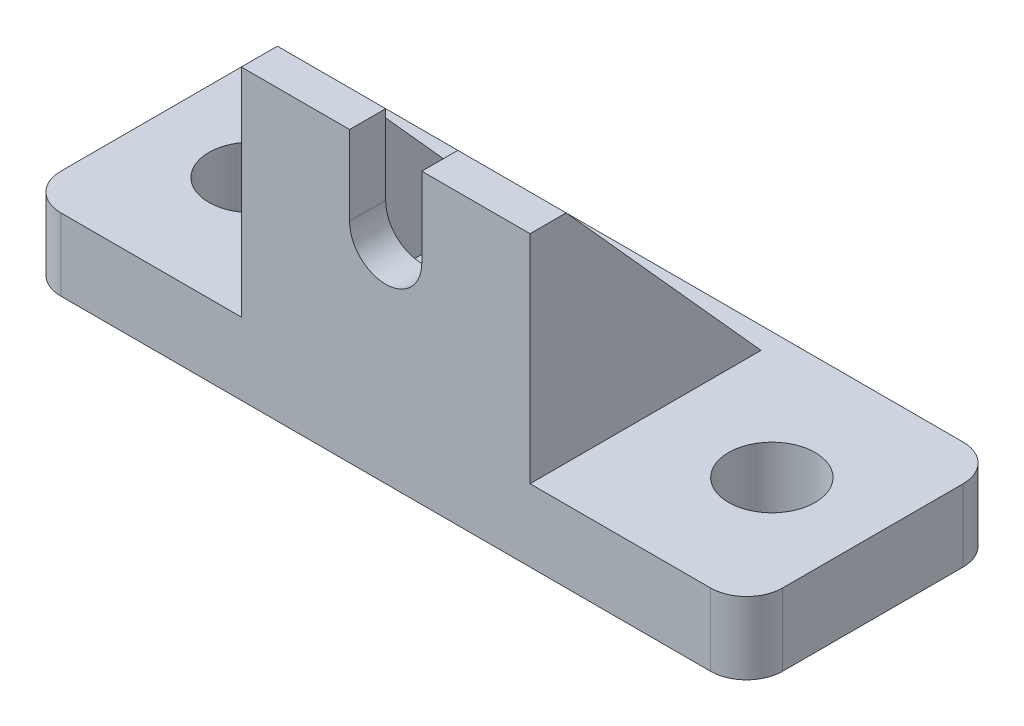
ISO-10303-21;
HEADER;
FILE_DESCRIPTION(('STEP AP214'),'2;1');
FILE_NAME('part.step','',(''),(''),'','','');
FILE_SCHEMA(('AUTOMOTIVE_DESIGN { 1 0 10303 214 1 1 1 1 }'));
ENDSEC;
DATA;
#1=APPLICATION_CONTEXT('core data for automotive mechanical design processes');
#2=APPLICATION_PROTOCOL_DEFINITION('international standard','automotive_design',2000,#1);
#3=PRODUCT_CONTEXT('',#1,'mechanical');
#4=PRODUCT('Part','Part','',(#3));
#5=PRODUCT_RELATED_PRODUCT_CATEGORY('part','',(#4));
#6=PRODUCT_DEFINITION_FORMATION('','',#4);
#7=PRODUCT_DEFINITION_CONTEXT('part definition',#1,'design');
#8=PRODUCT_DEFINITION('design','',#6,#7);
#9=PRODUCT_DEFINITION_SHAPE('','',#8);
#10=(LENGTH_UNIT() NAMED_UNIT(*) SI_UNIT(.MILLI.,.METRE.));
#11=(NAMED_UNIT(*) PLANE_ANGLE_UNIT() SI_UNIT($,.RADIAN.));
#12=(NAMED_UNIT(*) SI_UNIT($,.STERADIAN.) SOLID_ANGLE_UNIT());
#13=UNCERTAINTY_MEASURE_WITH_UNIT(LENGTH_MEASURE(1.E-05),#10,'distance_accuracy_value','');
#14=(GEOMETRIC_REPRESENTATION_CONTEXT(3) GLOBAL_UNCERTAINTY_ASSIGNED_CONTEXT((#13)) GLOBAL_UNIT_ASSIGNED_CONTEXT((#10,
#11,#12)) REPRESENTATION_CONTEXT('',''));
#15=CARTESIAN_POINT('',(0.,0.,0.));
#16=DIRECTION('',(0.,0.,1.));
#17=DIRECTION('',(1.,0.,0.));
#18=AXIS2_PLACEMENT_3D('',#15,#16,#17);
#19=CARTESIAN_POINT('',(0.,0.,57.0166014591585));
#20=DIRECTION('',(0.,0.,1.));
#21=DIRECTION('',(1.,0.,0.));
#22=AXIS2_PLACEMENT_3D('',#19,#20,#21);
#23=PLANE('',#22);
#24=DIRECTION('',(0.,-1.,0.));
#25=VECTOR('',#24,1.);
#26=CARTESIAN_POINT('',(-112.676154711175,0.,57.0166014591585));
#27=LINE('',#26,#25);
#28=CARTESIAN_POINT('',(-112.676154711175,40.,57.0166014591585));
#29=VERTEX_POINT('',#28);
#30=CARTESIAN_POINT('',(-112.676154711175,10.,57.0166014591585));
#31=VERTEX_POINT('',#30);
#32=EDGE_CURVE('E194',#29,#31,#27,.T.);
#33=ORIENTED_EDGE('',*,*,#32,.F.);
#34=DIRECTION('',(1.,0.,0.));
#35=VECTOR('',#34,1.);
#36=CARTESIAN_POINT('',(0.,40.,57.0166014591585));
#37=LINE('',#36,#35);
#38=CARTESIAN_POINT('',(-102.676154711175,40.,57.0166014591585));
#39=VERTEX_POINT('',#38);
#40=EDGE_CURVE('E177',#29,#39,#37,.T.);
#41=ORIENTED_EDGE('',*,*,#40,.T.);
#42=DIRECTION('',(0.,-1.,0.));
#43=VECTOR('',#42,1.);
#44=CARTESIAN_POINT('',(-102.676154711175,0.,57.0166014591585));
#45=LINE('',#44,#43);
#46=CARTESIAN_POINT('',(-102.676154711175,29.,57.0166014591585));
#47=VERTEX_POINT('',#46);
#48=EDGE_CURVE('E189',#39,#47,#45,.T.);
#49=ORIENTED_EDGE('',*,*,#48,.T.);
#50=CARTESIAN_POINT('',(-97.6761547111748,28.9367257155802,57.0166014591585));
#51=DIRECTION('',(0.,0.,1.));
#52=DIRECTION('',(1.,0.,0.));
#53=AXIS2_PLACEMENT_3D('',#50,#51,#52);
#54=CIRCLE('',#53,5.00040034747908);
#55=CARTESIAN_POINT('',(-92.6761547111748,29.,57.0166014591585));
#56=VERTEX_POINT('',#55);
#57=EDGE_CURVE('E236',#47,#56,#54,.T.);
#58=ORIENTED_EDGE('',*,*,#57,.T.);
#59=DIRECTION('',(0.,-1.,0.));
#60=VECTOR('',#59,1.);
#61=CARTESIAN_POINT('',(-92.6761547111748,0.,57.0166014591585));
#62=LINE('',#61,#60);
#63=CARTESIAN_POINT('',(-92.6761547111748,40.,57.0166014591585));
#64=VERTEX_POINT('',#63);
#65=EDGE_CURVE('E244',#64,#56,#62,.T.);
#66=ORIENTED_EDGE('',*,*,#65,.F.);
#67=CARTESIAN_POINT('',(-82.6761547111748,40.,57.0166014591585));
#68=VERTEX_POINT('',#67);
#69=EDGE_CURVE('E209',#64,#68,#37,.T.);
#70=ORIENTED_EDGE('',*,*,#69,.T.);
#71=DIRECTION('',(0.,1.,0.));
#72=VECTOR('',#71,1.);
#73=CARTESIAN_POINT('',(-82.6761547111748,0.,57.0166014591585));
#74=LINE('',#73,#72);
#75=CARTESIAN_POINT('',(-82.6761547111748,10.,57.0166014591585));
#76=VERTEX_POINT('',#75);
#77=EDGE_CURVE('E11',#76,#68,#74,.T.);
#78=ORIENTED_EDGE('',*,*,#77,.F.);
#79=DIRECTION('',(-1.,0.,0.));
#80=VECTOR('',#79,1.);
#81=CARTESIAN_POINT('',(0.,10.,57.0166014591585));
#82=LINE('',#81,#80);
#83=EDGE_CURVE('E196',#76,#31,#82,.T.);
#84=ORIENTED_EDGE('',*,*,#83,.T.);
#85=EDGE_LOOP('',(#33,#41,#49,#58,#66,#70,#78,#84));
#86=FACE_BOUND('',#85,.T.);
#87=ADVANCED_FACE('F47',(#86),#23,.F.);
#88=CARTESIAN_POINT('',(-142.676154711175,10.,57.0166014591585));
#89=DIRECTION('',(0.,1.,0.));
#90=DIRECTION('',(0.,0.,1.));
#91=AXIS2_PLACEMENT_3D('',#88,#89,#90);
#92=PLANE('',#91);
#93=DIRECTION('',(0.,0.,1.));
#94=VECTOR('',#93,1.);
#95=CARTESIAN_POINT('',(-117.676154711175,10.,57.0166014591585));
#96=LINE('',#95,#94);
#97=CARTESIAN_POINT('',(-117.676154711175,10.,30.0166014591585));
#98=VERTEX_POINT('',#97);
#99=CARTESIAN_POINT('',(-117.676154711175,10.,62.0166014591585));
#100=VERTEX_POINT('',#99);
#101=EDGE_CURVE('E63',#98,#100,#96,.T.);
#102=ORIENTED_EDGE('',*,*,#101,.F.);
#103=DIRECTION('',(-1.,0.,0.));
#104=VECTOR('',#103,1.);
#105=CARTESIAN_POINT('',(-142.676154711175,10.,30.0166014591585));
#106=LINE('',#105,#104);
#107=CARTESIAN_POINT('',(-112.676154711175,10.,30.0166014591585));
#108=VERTEX_POINT('',#107);
#109=EDGE_CURVE('E67',#108,#98,#106,.T.);
#110=ORIENTED_EDGE('',*,*,#109,.F.);
#111=DIRECTION('',(0.,0.,1.));
#112=VECTOR('',#111,1.);
#113=CARTESIAN_POINT('',(-112.676154711175,10.,57.0166014591585));
#114=LINE('',#113,#112);
#115=EDGE_CURVE('E200',#108,#31,#114,.T.);
#116=ORIENTED_EDGE('',*,*,#115,.T.);
#117=ORIENTED_EDGE('',*,*,#83,.F.);
#118=DIRECTION('',(0.,0.,-1.));
#119=VECTOR('',#118,1.);
#120=CARTESIAN_POINT('',(-82.6761547111748,10.,57.0166014591585));
#121=LINE('',#120,#119);
#122=CARTESIAN_POINT('',(-82.6761547111748,10.,30.0166014591585));
#123=VERTEX_POINT('',#122);
#124=EDGE_CURVE('E225',#76,#123,#121,.T.);
#125=ORIENTED_EDGE('',*,*,#124,.T.);
#126=DIRECTION('',(1.,0.,0.));
#127=VECTOR('',#126,1.);
#128=CARTESIAN_POINT('',(-142.676154711175,10.,30.0166014591584));
#129=LINE('',#128,#127);
#130=CARTESIAN_POINT('',(-77.6761547111748,10.,30.0166014591585));
#131=VERTEX_POINT('',#130);
#132=EDGE_CURVE('E231',#131,#123,#129,.F.);
#133=ORIENTED_EDGE('',*,*,#132,.F.);
#134=DIRECTION('',(0.,0.,1.));
#135=VECTOR('',#134,1.);
#136=CARTESIAN_POINT('',(-77.6761547111748,10.,57.0166014591585));
#137=LINE('',#136,#135);
#138=CARTESIAN_POINT('',(-77.6761547111748,10.,62.0166014591585));
#139=VERTEX_POINT('',#138);
#140=EDGE_CURVE('E280',#131,#139,#137,.T.);
#141=ORIENTED_EDGE('',*,*,#140,.T.);
#142=DIRECTION('',(1.,0.,0.));
#143=VECTOR('',#142,1.);
#144=CARTESIAN_POINT('',(-142.676154711175,10.,62.0166014591585));
#145=LINE('',#144,#143);
#146=CARTESIAN_POINT('',(-52.6761547111748,10.,62.0166014591585));
#147=VERTEX_POINT('',#146);
#148=EDGE_CURVE('E314',#139,#147,#145,.T.);
#149=ORIENTED_EDGE('',*,*,#148,.T.);
#150=CARTESIAN_POINT('',(-52.6761547111748,10.,57.0166014591585));
#151=DIRECTION('',(0.,1.,0.));
#152=DIRECTION('',(0.,0.,1.));
#153=AXIS2_PLACEMENT_3D('',#150,#151,#152);
#154=CIRCLE('',#153,5.);
#155=CARTESIAN_POINT('',(-47.6761547111748,10.,57.0166014591585));
#156=VERTEX_POINT('',#155);
#157=EDGE_CURVE('E319',#147,#156,#154,.T.);
#158=ORIENTED_EDGE('',*,*,#157,.T.);
#159=DIRECTION('',(0.,0.,-1.));
#160=VECTOR('',#159,1.);
#161=CARTESIAN_POINT('',(-47.6761547111748,10.,32.0166014591585));
#162=LINE('',#161,#160);
#163=CARTESIAN_POINT('',(-47.6761547111748,10.,32.0166014591585));
#164=VERTEX_POINT('',#163);
#165=EDGE_CURVE('E322',#156,#164,#162,.T.);
#166=ORIENTED_EDGE('',*,*,#165,.T.);
#167=CARTESIAN_POINT('',(-52.6761547111748,10.,32.0166014591585));
#168=DIRECTION('',(0.,1.,0.));
#169=DIRECTION('',(0.,0.,-1.));
#170=AXIS2_PLACEMENT_3D('',#167,#168,#169);
#171=CIRCLE('',#170,5.);
#172=CARTESIAN_POINT('',(-52.6761547111748,10.,27.0166014591585));
#173=VERTEX_POINT('',#172);
#174=EDGE_CURVE('E325',#164,#173,#171,.T.);
#175=ORIENTED_EDGE('',*,*,#174,.T.);
#176=DIRECTION('',(-1.,0.,0.));
#177=VECTOR('',#176,1.);
#178=CARTESIAN_POINT('',(-142.676154711175,10.,27.0166014591585));
#179=LINE('',#178,#177);
#180=CARTESIAN_POINT('',(-142.676154711175,10.,27.0166014591585));
#181=VERTEX_POINT('',#180);
#182=EDGE_CURVE('E328',#173,#181,#179,.T.);
#183=ORIENTED_EDGE('',*,*,#182,.T.);
#184=CARTESIAN_POINT('',(-142.676154711175,10.,32.0166014591585));
#185=DIRECTION('',(0.,1.,0.));
#186=DIRECTION('',(0.,0.,1.));
#187=AXIS2_PLACEMENT_3D('',#184,#185,#186);
#188=CIRCLE('',#187,5.);
#189=CARTESIAN_POINT('',(-147.676154711175,10.,32.0166014591585));
#190=VERTEX_POINT('',#189);
#191=EDGE_CURVE('E331',#181,#190,#188,.T.);
#192=ORIENTED_EDGE('',*,*,#191,.T.);
#193=DIRECTION('',(0.,0.,1.));
#194=VECTOR('',#193,1.);
#195=CARTESIAN_POINT('',(-147.676154711175,10.,32.0166014591585));
#196=LINE('',#195,#194);
#197=CARTESIAN_POINT('',(-147.676154711175,10.,57.0166014591585));
#198=VERTEX_POINT('',#197);
#199=EDGE_CURVE('E334',#190,#198,#196,.T.);
#200=ORIENTED_EDGE('',*,*,#199,.T.);
#201=CARTESIAN_POINT('',(-142.676154711175,10.,57.0166014591585));
#202=DIRECTION('',(0.,1.,0.));
#203=DIRECTION('',(0.,0.,1.));
#204=AXIS2_PLACEMENT_3D('',#201,#202,#203);
#205=CIRCLE('',#204,5.);
#206=CARTESIAN_POINT('',(-142.676154711175,10.,62.0166014591585));
#207=VERTEX_POINT('',#206);
#208=EDGE_CURVE('E310',#198,#207,#205,.T.);
#209=ORIENTED_EDGE('',*,*,#208,.T.);
#210=EDGE_CURVE('E316',#207,#100,#145,.T.);
#211=ORIENTED_EDGE('',*,*,#210,.T.);
#212=EDGE_LOOP('',(#102,#110,#116,#117,#125,#133,#141,#149,#158,#166,#175,#183,#192,#200,#209,#211));
#213=FACE_BOUND('',#212,.T.);
#214=CARTESIAN_POINT('',(-133.676154711175,10.,44.5166014591585));
#215=DIRECTION('',(0.,1.,0.));
#216=DIRECTION('',(0.,0.,1.));
#217=AXIS2_PLACEMENT_3D('',#214,#215,#216);
#218=CIRCLE('',#217,6.00000000000002);
#219=CARTESIAN_POINT('',(-133.676154711175,10.,50.5166014591585));
#220=VERTEX_POINT('',#219);
#221=EDGE_CURVE('E302',#220,#220,#218,.T.);
#222=ORIENTED_EDGE('',*,*,#221,.F.);
#223=EDGE_LOOP('',(#222));
#224=FACE_BOUND('',#223,.T.);
#225=CARTESIAN_POINT('',(-61.6761547111748,10.,44.5166014591585));
#226=DIRECTION('',(0.,1.,0.));
#227=DIRECTION('',(0.,0.,1.));
#228=AXIS2_PLACEMENT_3D('',#225,#226,#227);
#229=CIRCLE('',#228,6.);
#230=CARTESIAN_POINT('',(-61.6761547111748,10.,50.5166014591585));
#231=VERTEX_POINT('',#230);
#232=EDGE_CURVE('E294',#231,#231,#229,.T.);
#233=ORIENTED_EDGE('',*,*,#232,.F.);
#234=EDGE_LOOP('',(#233));
#235=FACE_BOUND('',#234,.T.);
#236=ADVANCED_FACE('F415',(#213,#224,#235),#92,.T.);
#237=CARTESIAN_POINT('',(-142.676154711175,0.,57.0166014591585));
#238=DIRECTION('',(0.,1.,0.));
#239=DIRECTION('',(0.,0.,1.));
#240=AXIS2_PLACEMENT_3D('',#237,#238,#239);
#241=PLANE('',#240);
#242=CARTESIAN_POINT('',(-142.676154711175,0.,32.0166014591585));
#243=DIRECTION('',(0.,1.,0.));
#244=DIRECTION('',(0.,0.,1.));
#245=AXIS2_PLACEMENT_3D('',#242,#243,#244);
#246=CIRCLE('',#245,5.);
#247=CARTESIAN_POINT('',(-142.676154711175,0.,27.0166014591585));
#248=VERTEX_POINT('',#247);
#249=CARTESIAN_POINT('',(-147.676154711175,0.,32.0166014591585));
#250=VERTEX_POINT('',#249);
#251=EDGE_CURVE('E356',#248,#250,#246,.T.);
#252=ORIENTED_EDGE('',*,*,#251,.F.);
#253=DIRECTION('',(-1.,0.,0.));
#254=VECTOR('',#253,1.);
#255=CARTESIAN_POINT('',(-142.676154711175,0.,27.0166014591585));
#256=LINE('',#255,#254);
#257=CARTESIAN_POINT('',(-52.6761547111748,0.,27.0166014591585));
#258=VERTEX_POINT('',#257);
#259=EDGE_CURVE('E353',#258,#248,#256,.T.);
#260=ORIENTED_EDGE('',*,*,#259,.F.);
#261=CARTESIAN_POINT('',(-52.6761547111748,0.,32.0166014591585));
#262=DIRECTION('',(0.,1.,0.));
#263=DIRECTION('',(0.,0.,-1.));
#264=AXIS2_PLACEMENT_3D('',#261,#262,#263);
#265=CIRCLE('',#264,5.);
#266=CARTESIAN_POINT('',(-47.6761547111748,0.,32.0166014591585));
#267=VERTEX_POINT('',#266);
#268=EDGE_CURVE('E350',#267,#258,#265,.T.);
#269=ORIENTED_EDGE('',*,*,#268,.F.);
#270=DIRECTION('',(0.,0.,-1.));
#271=VECTOR('',#270,1.);
#272=CARTESIAN_POINT('',(-47.6761547111748,0.,32.0166014591585));
#273=LINE('',#272,#271);
#274=CARTESIAN_POINT('',(-47.6761547111748,0.,57.0166014591585));
#275=VERTEX_POINT('',#274);
#276=EDGE_CURVE('E347',#275,#267,#273,.T.);
#277=ORIENTED_EDGE('',*,*,#276,.F.);
#278=CARTESIAN_POINT('',(-52.6761547111748,0.,57.0166014591585));
#279=DIRECTION('',(0.,1.,0.));
#280=DIRECTION('',(0.,0.,1.));
#281=AXIS2_PLACEMENT_3D('',#278,#279,#280);
#282=CIRCLE('',#281,5.);
#283=CARTESIAN_POINT('',(-52.6761547111748,0.,62.0166014591585));
#284=VERTEX_POINT('',#283);
#285=EDGE_CURVE('E344',#284,#275,#282,.T.);
#286=ORIENTED_EDGE('',*,*,#285,.F.);
#287=DIRECTION('',(1.,0.,0.));
#288=VECTOR('',#287,1.);
#289=CARTESIAN_POINT('',(-142.676154711175,0.,62.0166014591585));
#290=LINE('',#289,#288);
#291=CARTESIAN_POINT('',(-142.676154711175,0.,62.0166014591585));
#292=VERTEX_POINT('',#291);
#293=EDGE_CURVE('E341',#292,#284,#290,.T.);
#294=ORIENTED_EDGE('',*,*,#293,.F.);
#295=CARTESIAN_POINT('',(-142.676154711175,0.,57.0166014591585));
#296=DIRECTION('',(0.,1.,0.));
#297=DIRECTION('',(0.,0.,1.));
#298=AXIS2_PLACEMENT_3D('',#295,#296,#297);
#299=CIRCLE('',#298,5.);
#300=CARTESIAN_POINT('',(-147.676154711175,0.,57.0166014591585));
#301=VERTEX_POINT('',#300);
#302=EDGE_CURVE('E306',#301,#292,#299,.T.);
#303=ORIENTED_EDGE('',*,*,#302,.F.);
#304=DIRECTION('',(0.,0.,1.));
#305=VECTOR('',#304,1.);
#306=CARTESIAN_POINT('',(-147.676154711175,0.,32.0166014591585));
#307=LINE('',#306,#305);
#308=EDGE_CURVE('E315',#250,#301,#307,.T.);
#309=ORIENTED_EDGE('',*,*,#308,.F.);
#310=EDGE_LOOP('',(#252,#260,#269,#277,#286,#294,#303,#309));
#311=FACE_BOUND('',#310,.T.);
#312=CARTESIAN_POINT('',(-133.676154711175,0.,44.5166014591585));
#313=DIRECTION('',(0.,1.,0.));
#314=DIRECTION('',(0.,0.,1.));
#315=AXIS2_PLACEMENT_3D('',#312,#313,#314);
#316=CIRCLE('',#315,6.00000000000002);
#317=CARTESIAN_POINT('',(-133.676154711175,0.,50.5166014591585));
#318=VERTEX_POINT('',#317);
#319=EDGE_CURVE('E298',#318,#318,#316,.T.);
#320=ORIENTED_EDGE('',*,*,#319,.T.);
#321=EDGE_LOOP('',(#320));
#322=FACE_BOUND('',#321,.T.);
#323=CARTESIAN_POINT('',(-61.6761547111748,0.,44.5166014591585));
#324=DIRECTION('',(0.,1.,0.));
#325=DIRECTION('',(0.,0.,1.));
#326=AXIS2_PLACEMENT_3D('',#323,#324,#325);
#327=CIRCLE('',#326,6.);
#328=CARTESIAN_POINT('',(-61.6761547111748,0.,50.5166014591585));
#329=VERTEX_POINT('',#328);
#330=EDGE_CURVE('E272',#329,#329,#327,.T.);
#331=ORIENTED_EDGE('',*,*,#330,.T.);
#332=EDGE_LOOP('',(#331));
#333=FACE_BOUND('',#332,.T.);
#334=ADVANCED_FACE('F401',(#311,#322,#333),#241,.F.);
#335=CARTESIAN_POINT('',(-142.676154711175,10.,57.0166014591585));
#336=DIRECTION('',(0.,-1.,0.));
#337=DIRECTION('',(0.,0.,-1.));
#338=AXIS2_PLACEMENT_3D('',#335,#336,#337);
#339=CYLINDRICAL_SURFACE('',#338,5.);
#340=ORIENTED_EDGE('',*,*,#302,.T.);
#341=DIRECTION('',(0.,-1.,0.));
#342=VECTOR('',#341,1.);
#343=CARTESIAN_POINT('',(-142.676154711175,10.,62.0166014591585));
#344=LINE('',#343,#342);
#345=EDGE_CURVE('E56',#207,#292,#344,.T.);
#346=ORIENTED_EDGE('',*,*,#345,.F.);
#347=ORIENTED_EDGE('',*,*,#208,.F.);
#348=DIRECTION('',(0.,-1.,0.));
#349=VECTOR('',#348,1.);
#350=CARTESIAN_POINT('',(-147.676154711175,10.,57.0166014591585));
#351=LINE('',#350,#349);
#352=EDGE_CURVE('E337',#198,#301,#351,.T.);
#353=ORIENTED_EDGE('',*,*,#352,.T.);
#354=EDGE_LOOP('',(#340,#346,#347,#353));
#355=FACE_BOUND('',#354,.T.);
#356=ADVANCED_FACE('F49',(#355),#339,.T.);
#357=CARTESIAN_POINT('',(-142.676154711175,10.,62.0166014591585));
#358=DIRECTION('',(0.,0.,-1.));
#359=DIRECTION('',(-1.,0.,0.));
#360=AXIS2_PLACEMENT_3D('',#357,#358,#359);
#361=PLANE('',#360);
#362=ORIENTED_EDGE('',*,*,#293,.T.);
#363=DIRECTION('',(0.,-1.,0.));
#364=VECTOR('',#363,1.);
#365=CARTESIAN_POINT('',(-52.6761547111748,10.,62.0166014591585));
#366=LINE('',#365,#364);
#367=EDGE_CURVE('E384',#147,#284,#366,.T.);
#368=ORIENTED_EDGE('',*,*,#367,.F.);
#369=ORIENTED_EDGE('',*,*,#148,.F.);
#370=DIRECTION('',(0.,1.,0.));
#371=VECTOR('',#370,1.);
#372=CARTESIAN_POINT('',(-77.6761547111748,0.,62.0166014591585));
#373=LINE('',#372,#371);
#374=CARTESIAN_POINT('',(-77.6761547111748,40.,62.0166014591585));
#375=VERTEX_POINT('',#374);
#376=EDGE_CURVE('E262',#139,#375,#373,.T.);
#377=ORIENTED_EDGE('',*,*,#376,.T.);
#378=DIRECTION('',(1.,0.,0.));
#379=VECTOR('',#378,1.);
#380=CARTESIAN_POINT('',(0.,40.,62.0166014591585));
#381=LINE('',#380,#379);
#382=CARTESIAN_POINT('',(-92.6761547111748,40.,62.0166014591585));
#383=VERTEX_POINT('',#382);
#384=EDGE_CURVE('E259',#383,#375,#381,.T.);
#385=ORIENTED_EDGE('',*,*,#384,.F.);
#386=DIRECTION('',(0.,-1.,0.));
#387=VECTOR('',#386,1.);
#388=CARTESIAN_POINT('',(-92.6761547111748,0.,62.0166014591585));
#389=LINE('',#388,#387);
#390=CARTESIAN_POINT('',(-92.6761547111748,29.,62.0166014591585));
#391=VERTEX_POINT('',#390);
#392=EDGE_CURVE('E239',#383,#391,#389,.T.);
#393=ORIENTED_EDGE('',*,*,#392,.T.);
#394=CARTESIAN_POINT('',(-97.6761547111748,28.9367257155802,62.0166014591585));
#395=DIRECTION('',(0.,0.,1.));
#396=DIRECTION('',(1.,0.,0.));
#397=AXIS2_PLACEMENT_3D('',#394,#395,#396);
#398=CIRCLE('',#397,5.00040034747908);
#399=CARTESIAN_POINT('',(-102.676154711175,29.,62.0166014591585));
#400=VERTEX_POINT('',#399);
#401=EDGE_CURVE('E235',#400,#391,#398,.T.);
#402=ORIENTED_EDGE('',*,*,#401,.F.);
#403=DIRECTION('',(0.,-1.,0.));
#404=VECTOR('',#403,1.);
#405=CARTESIAN_POINT('',(-102.676154711175,0.,62.0166014591585));
#406=LINE('',#405,#404);
#407=CARTESIAN_POINT('',(-102.676154711175,40.,62.0166014591585));
#408=VERTEX_POINT('',#407);
#409=EDGE_CURVE('E252',#408,#400,#406,.T.);
#410=ORIENTED_EDGE('',*,*,#409,.F.);
#411=CARTESIAN_POINT('',(-117.676154711175,40.,62.0166014591585));
#412=VERTEX_POINT('',#411);
#413=EDGE_CURVE('E255',#412,#408,#381,.T.);
#414=ORIENTED_EDGE('',*,*,#413,.F.);
#415=DIRECTION('',(0.,1.,0.));
#416=VECTOR('',#415,1.);
#417=CARTESIAN_POINT('',(-117.676154711175,0.,62.0166014591585));
#418=LINE('',#417,#416);
#419=EDGE_CURVE('E258',#100,#412,#418,.T.);
#420=ORIENTED_EDGE('',*,*,#419,.F.);
#421=ORIENTED_EDGE('',*,*,#210,.F.);
#422=ORIENTED_EDGE('',*,*,#345,.T.);
#423=EDGE_LOOP('',(#362,#368,#369,#377,#385,#393,#402,#410,#414,#420,#421,#422));
#424=FACE_BOUND('',#423,.T.);
#425=ADVANCED_FACE('F391',(#424),#361,.F.);
#426=CARTESIAN_POINT('',(-52.6761547111748,10.,57.0166014591585));
#427=DIRECTION('',(0.,-1.,0.));
#428=DIRECTION('',(0.,0.,-1.));
#429=AXIS2_PLACEMENT_3D('',#426,#427,#428);
#430=CYLINDRICAL_SURFACE('',#429,5.);
#431=ORIENTED_EDGE('',*,*,#285,.T.);
#432=DIRECTION('',(0.,-1.,0.));
#433=VECTOR('',#432,1.);
#434=CARTESIAN_POINT('',(-47.6761547111748,10.,57.0166014591585));
#435=LINE('',#434,#433);
#436=EDGE_CURVE('E380',#156,#275,#435,.T.);
#437=ORIENTED_EDGE('',*,*,#436,.F.);
#438=ORIENTED_EDGE('',*,*,#157,.F.);
#439=ORIENTED_EDGE('',*,*,#367,.T.);
#440=EDGE_LOOP('',(#431,#437,#438,#439));
#441=FACE_BOUND('',#440,.T.);
#442=ADVANCED_FACE('F408',(#441),#430,.T.);
#443=CARTESIAN_POINT('',(-47.6761547111748,10.,32.0166014591585));
#444=DIRECTION('',(-1.,0.,0.));
#445=DIRECTION('',(0.,0.,1.));
#446=AXIS2_PLACEMENT_3D('',#443,#444,#445);
#447=PLANE('',#446);
#448=ORIENTED_EDGE('',*,*,#276,.T.);
#449=DIRECTION('',(0.,-1.,0.));
#450=VECTOR('',#449,1.);
#451=CARTESIAN_POINT('',(-47.6761547111748,10.,32.0166014591585));
#452=LINE('',#451,#450);
#453=EDGE_CURVE('E376',#164,#267,#452,.T.);
#454=ORIENTED_EDGE('',*,*,#453,.F.);
#455=ORIENTED_EDGE('',*,*,#165,.F.);
#456=ORIENTED_EDGE('',*,*,#436,.T.);
#457=EDGE_LOOP('',(#448,#454,#455,#456));
#458=FACE_BOUND('',#457,.T.);
#459=ADVANCED_FACE('F412',(#458),#447,.F.);
#460=CARTESIAN_POINT('',(-52.6761547111748,10.,32.0166014591585));
#461=DIRECTION('',(0.,-1.,0.));
#462=DIRECTION('',(0.,0.,-1.));
#463=AXIS2_PLACEMENT_3D('',#460,#461,#462);
#464=CYLINDRICAL_SURFACE('',#463,5.);
#465=ORIENTED_EDGE('',*,*,#268,.T.);
#466=DIRECTION('',(0.,-1.,0.));
#467=VECTOR('',#466,1.);
#468=CARTESIAN_POINT('',(-52.6761547111748,10.,27.0166014591585));
#469=LINE('',#468,#467);
#470=EDGE_CURVE('E372',#173,#258,#469,.T.);
#471=ORIENTED_EDGE('',*,*,#470,.F.);
#472=ORIENTED_EDGE('',*,*,#174,.F.);
#473=ORIENTED_EDGE('',*,*,#453,.T.);
#474=EDGE_LOOP('',(#465,#471,#472,#473));
#475=FACE_BOUND('',#474,.T.);
#476=ADVANCED_FACE('F495',(#475),#464,.T.);
#477=CARTESIAN_POINT('',(-142.676154711175,10.,27.0166014591585));
#478=DIRECTION('',(0.,0.,1.));
#479=DIRECTION('',(1.,0.,0.));
#480=AXIS2_PLACEMENT_3D('',#477,#478,#479);
#481=PLANE('',#480);
#482=ORIENTED_EDGE('',*,*,#259,.T.);
#483=DIRECTION('',(0.,-1.,0.));
#484=VECTOR('',#483,1.);
#485=CARTESIAN_POINT('',(-142.676154711175,10.,27.0166014591585));
#486=LINE('',#485,#484);
#487=EDGE_CURVE('E368',#181,#248,#486,.T.);
#488=ORIENTED_EDGE('',*,*,#487,.F.);
#489=ORIENTED_EDGE('',*,*,#182,.F.);
#490=ORIENTED_EDGE('',*,*,#470,.T.);
#491=EDGE_LOOP('',(#482,#488,#489,#490));
#492=FACE_BOUND('',#491,.T.);
#493=ADVANCED_FACE('F492',(#492),#481,.F.);
#494=CARTESIAN_POINT('',(-142.676154711175,10.,32.0166014591585));
#495=DIRECTION('',(0.,-1.,0.));
#496=DIRECTION('',(0.,0.,-1.));
#497=AXIS2_PLACEMENT_3D('',#494,#495,#496);
#498=CYLINDRICAL_SURFACE('',#497,5.);
#499=ORIENTED_EDGE('',*,*,#251,.T.);
#500=DIRECTION('',(0.,-1.,0.));
#501=VECTOR('',#500,1.);
#502=CARTESIAN_POINT('',(-147.676154711175,10.,32.0166014591585));
#503=LINE('',#502,#501);
#504=EDGE_CURVE('E364',#190,#250,#503,.T.);
#505=ORIENTED_EDGE('',*,*,#504,.F.);
#506=ORIENTED_EDGE('',*,*,#191,.F.);
#507=ORIENTED_EDGE('',*,*,#487,.T.);
#508=EDGE_LOOP('',(#499,#505,#506,#507));
#509=FACE_BOUND('',#508,.T.);
#510=ADVANCED_FACE('F488',(#509),#498,.T.);
#511=CARTESIAN_POINT('',(-147.676154711175,10.,32.0166014591585));
#512=DIRECTION('',(1.,0.,0.));
#513=DIRECTION('',(0.,0.,-1.));
#514=AXIS2_PLACEMENT_3D('',#511,#512,#513);
#515=PLANE('',#514);
#516=ORIENTED_EDGE('',*,*,#308,.T.);
#517=ORIENTED_EDGE('',*,*,#352,.F.);
#518=ORIENTED_EDGE('',*,*,#199,.F.);
#519=ORIENTED_EDGE('',*,*,#504,.T.);
#520=EDGE_LOOP('',(#516,#517,#518,#519));
#521=FACE_BOUND('',#520,.T.);
#522=ADVANCED_FACE('F486',(#521),#515,.F.);
#523=CARTESIAN_POINT('',(-133.676154711175,10.,44.5166014591585));
#524=DIRECTION('',(0.,-1.,0.));
#525=DIRECTION('',(0.,0.,-1.));
#526=AXIS2_PLACEMENT_3D('',#523,#524,#525);
#527=CYLINDRICAL_SURFACE('',#526,6.00000000000002);
#528=ORIENTED_EDGE('',*,*,#221,.T.);
#529=EDGE_LOOP('',(#528));
#530=FACE_BOUND('',#529,.T.);
#531=ORIENTED_EDGE('',*,*,#319,.F.);
#532=EDGE_LOOP('',(#531));
#533=FACE_BOUND('',#532,.T.);
#534=ADVANCED_FACE('F520',(#530,#533),#527,.F.);
#535=CARTESIAN_POINT('',(-61.6761547111748,10.,44.5166014591585));
#536=DIRECTION('',(0.,-1.,0.));
#537=DIRECTION('',(0.,0.,-1.));
#538=AXIS2_PLACEMENT_3D('',#535,#536,#537);
#539=CYLINDRICAL_SURFACE('',#538,6.);
#540=ORIENTED_EDGE('',*,*,#232,.T.);
#541=EDGE_LOOP('',(#540));
#542=FACE_BOUND('',#541,.T.);
#543=ORIENTED_EDGE('',*,*,#330,.F.);
#544=EDGE_LOOP('',(#543));
#545=FACE_BOUND('',#544,.T.);
#546=ADVANCED_FACE('F536',(#542,#545),#539,.F.);
#547=CARTESIAN_POINT('',(-97.6761547111748,28.9367257155802,57.0166014591585));
#548=DIRECTION('',(0.,0.,1.));
#549=DIRECTION('',(1.,0.,0.));
#550=AXIS2_PLACEMENT_3D('',#547,#548,#549);
#551=CYLINDRICAL_SURFACE('',#550,5.00040034747908);
#552=ORIENTED_EDGE('',*,*,#401,.T.);
#553=DIRECTION('',(0.,0.,1.));
#554=VECTOR('',#553,1.);
#555=CARTESIAN_POINT('',(-92.6761547111748,29.,57.0166014591585));
#556=LINE('',#555,#554);
#557=EDGE_CURVE('E269',#56,#391,#556,.T.);
#558=ORIENTED_EDGE('',*,*,#557,.F.);
#559=ORIENTED_EDGE('',*,*,#57,.F.);
#560=DIRECTION('',(0.,0.,1.));
#561=VECTOR('',#560,1.);
#562=CARTESIAN_POINT('',(-102.676154711175,29.,57.0166014591585));
#563=LINE('',#562,#561);
#564=EDGE_CURVE('E248',#47,#400,#563,.T.);
#565=ORIENTED_EDGE('',*,*,#564,.T.);
#566=EDGE_LOOP('',(#552,#558,#559,#565));
#567=FACE_BOUND('',#566,.T.);
#568=ADVANCED_FACE('F449',(#567),#551,.F.);
#569=CARTESIAN_POINT('',(-92.6761547111748,0.,57.0166014591585));
#570=DIRECTION('',(-1.,0.,0.));
#571=DIRECTION('',(0.,0.,1.));
#572=AXIS2_PLACEMENT_3D('',#569,#570,#571);
#573=PLANE('',#572);
#574=ORIENTED_EDGE('',*,*,#392,.F.);
#575=DIRECTION('',(0.,0.,1.));
#576=VECTOR('',#575,1.);
#577=CARTESIAN_POINT('',(-92.6761547111748,40.,57.0166014591585));
#578=LINE('',#577,#576);
#579=EDGE_CURVE('E273',#64,#383,#578,.T.);
#580=ORIENTED_EDGE('',*,*,#579,.F.);
#581=ORIENTED_EDGE('',*,*,#65,.T.);
#582=ORIENTED_EDGE('',*,*,#557,.T.);
#583=EDGE_LOOP('',(#574,#580,#581,#582));
#584=FACE_BOUND('',#583,.T.);
#585=ADVANCED_FACE('F444',(#584),#573,.T.);
#586=CARTESIAN_POINT('',(0.,40.,57.0166014591585));
#587=DIRECTION('',(0.,-1.,0.));
#588=DIRECTION('',(0.,0.,-1.));
#589=AXIS2_PLACEMENT_3D('',#586,#587,#588);
#590=PLANE('',#589);
#591=CARTESIAN_POINT('',(-77.6761547111748,40.,57.0166014591585));
#592=VERTEX_POINT('',#591);
#593=EDGE_CURVE('E191',#68,#592,#37,.T.);
#594=ORIENTED_EDGE('',*,*,#593,.F.);
#595=ORIENTED_EDGE('',*,*,#69,.F.);
#596=ORIENTED_EDGE('',*,*,#579,.T.);
#597=ORIENTED_EDGE('',*,*,#384,.T.);
#598=DIRECTION('',(0.,0.,1.));
#599=VECTOR('',#598,1.);
#600=CARTESIAN_POINT('',(-77.6761547111748,40.,57.0166014591585));
#601=LINE('',#600,#599);
#602=EDGE_CURVE('E276',#592,#375,#601,.T.);
#603=ORIENTED_EDGE('',*,*,#602,.F.);
#604=EDGE_LOOP('',(#594,#595,#596,#597,#603));
#605=FACE_BOUND('',#604,.T.);
#606=ADVANCED_FACE('F428',(#605),#590,.F.);
#607=CARTESIAN_POINT('',(-77.6761547111748,0.,57.0166014591585));
#608=DIRECTION('',(1.,0.,0.));
#609=DIRECTION('',(0.,0.,-1.));
#610=AXIS2_PLACEMENT_3D('',#607,#608,#609);
#611=PLANE('',#610);
#612=ORIENTED_EDGE('',*,*,#376,.F.);
#613=ORIENTED_EDGE('',*,*,#140,.F.);
#614=DIRECTION('',(0.,-0.743294146247166,-0.66896473162245));
#615=VECTOR('',#614,1.);
#616=CARTESIAN_POINT('',(-77.6761547111748,40.,57.0166014591585));
#617=LINE('',#616,#615);
#618=EDGE_CURVE('E221',#592,#131,#617,.T.);
#619=ORIENTED_EDGE('',*,*,#618,.F.);
#620=ORIENTED_EDGE('',*,*,#602,.T.);
#621=EDGE_LOOP('',(#612,#613,#619,#620));
#622=FACE_BOUND('',#621,.T.);
#623=ADVANCED_FACE('F433',(#622),#611,.T.);
#624=CARTESIAN_POINT('',(-117.676154711175,0.,57.0166014591585));
#625=DIRECTION('',(1.,0.,0.));
#626=DIRECTION('',(0.,0.,-1.));
#627=AXIS2_PLACEMENT_3D('',#624,#625,#626);
#628=PLANE('',#627);
#629=ORIENTED_EDGE('',*,*,#419,.T.);
#630=DIRECTION('',(0.,0.,1.));
#631=VECTOR('',#630,1.);
#632=CARTESIAN_POINT('',(-117.676154711175,40.,57.0166014591585));
#633=LINE('',#632,#631);
#634=CARTESIAN_POINT('',(-117.676154711175,40.,57.0166014591585));
#635=VERTEX_POINT('',#634);
#636=EDGE_CURVE('E286',#635,#412,#633,.T.);
#637=ORIENTED_EDGE('',*,*,#636,.F.);
#638=DIRECTION('',(0.,-0.743294146247166,-0.66896473162245));
#639=VECTOR('',#638,1.);
#640=CARTESIAN_POINT('',(-117.676154711175,40.,57.0166014591585));
#641=LINE('',#640,#639);
#642=EDGE_CURVE('E201',#635,#98,#641,.T.);
#643=ORIENTED_EDGE('',*,*,#642,.T.);
#644=ORIENTED_EDGE('',*,*,#101,.T.);
#645=EDGE_LOOP('',(#629,#637,#643,#644));
#646=FACE_BOUND('',#645,.T.);
#647=ADVANCED_FACE('F462',(#646),#628,.F.);
#648=ORIENTED_EDGE('',*,*,#413,.T.);
#649=DIRECTION('',(0.,0.,1.));
#650=VECTOR('',#649,1.);
#651=CARTESIAN_POINT('',(-102.676154711175,40.,57.0166014591585));
#652=LINE('',#651,#650);
#653=EDGE_CURVE('E185',#39,#408,#652,.T.);
#654=ORIENTED_EDGE('',*,*,#653,.F.);
#655=ORIENTED_EDGE('',*,*,#40,.F.);
#656=EDGE_CURVE('E182',#635,#29,#37,.T.);
#657=ORIENTED_EDGE('',*,*,#656,.F.);
#658=ORIENTED_EDGE('',*,*,#636,.T.);
#659=EDGE_LOOP('',(#648,#654,#655,#657,#658));
#660=FACE_BOUND('',#659,.T.);
#661=ADVANCED_FACE('F179',(#660),#590,.F.);
#662=CARTESIAN_POINT('',(-102.676154711175,0.,57.0166014591585));
#663=DIRECTION('',(-1.,0.,0.));
#664=DIRECTION('',(0.,0.,1.));
#665=AXIS2_PLACEMENT_3D('',#662,#663,#664);
#666=PLANE('',#665);
#667=ORIENTED_EDGE('',*,*,#409,.T.);
#668=ORIENTED_EDGE('',*,*,#564,.F.);
#669=ORIENTED_EDGE('',*,*,#48,.F.);
#670=ORIENTED_EDGE('',*,*,#653,.T.);
#671=EDGE_LOOP('',(#667,#668,#669,#670));
#672=FACE_BOUND('',#671,.T.);
#673=ADVANCED_FACE('F452',(#672),#666,.F.);
#674=CARTESIAN_POINT('',(-77.6761547111748,40.,57.0166014591585));
#675=DIRECTION('',(0.,-0.66896473162245,0.743294146247166));
#676=DIRECTION('',(0.,-0.743294146247166,-0.66896473162245));
#677=AXIS2_PLACEMENT_3D('',#674,#675,#676);
#678=PLANE('',#677);
#679=ORIENTED_EDGE('',*,*,#618,.T.);
#680=ORIENTED_EDGE('',*,*,#132,.T.);
#681=DIRECTION('',(0.,-0.743294146247166,-0.66896473162245));
#682=VECTOR('',#681,1.);
#683=CARTESIAN_POINT('',(-82.6761547111748,40.,57.0166014591585));
#684=LINE('',#683,#682);
#685=EDGE_CURVE('E220',#68,#123,#684,.T.);
#686=ORIENTED_EDGE('',*,*,#685,.F.);
#687=ORIENTED_EDGE('',*,*,#593,.T.);
#688=EDGE_LOOP('',(#679,#680,#686,#687));
#689=FACE_BOUND('',#688,.T.);
#690=ADVANCED_FACE('F435',(#689),#678,.F.);
#691=CARTESIAN_POINT('',(-82.6761547111748,20.,44.5166014591585));
#692=DIRECTION('',(1.,0.,0.));
#693=DIRECTION('',(0.,0.,-1.));
#694=AXIS2_PLACEMENT_3D('',#691,#692,#693);
#695=PLANE('',#694);
#696=ORIENTED_EDGE('',*,*,#124,.F.);
#697=ORIENTED_EDGE('',*,*,#77,.T.);
#698=ORIENTED_EDGE('',*,*,#685,.T.);
#699=EDGE_LOOP('',(#696,#697,#698));
#700=FACE_BOUND('',#699,.T.);
#701=ADVANCED_FACE('F440',(#700),#695,.F.);
#702=CARTESIAN_POINT('',(-117.676154711175,40.,57.0166014591585));
#703=DIRECTION('',(0.,0.66896473162245,-0.743294146247166));
#704=DIRECTION('',(0.,-0.743294146247166,-0.66896473162245));
#705=AXIS2_PLACEMENT_3D('',#702,#703,#704);
#706=PLANE('',#705);
#707=DIRECTION('',(0.,-0.743294146247166,-0.66896473162245));
#708=VECTOR('',#707,1.);
#709=CARTESIAN_POINT('',(-112.676154711175,40.,57.0166014591585));
#710=LINE('',#709,#708);
#711=EDGE_CURVE('E206',#29,#108,#710,.T.);
#712=ORIENTED_EDGE('',*,*,#711,.T.);
#713=ORIENTED_EDGE('',*,*,#109,.T.);
#714=ORIENTED_EDGE('',*,*,#642,.F.);
#715=ORIENTED_EDGE('',*,*,#656,.T.);
#716=EDGE_LOOP('',(#712,#713,#714,#715));
#717=FACE_BOUND('',#716,.T.);
#718=ADVANCED_FACE('F205',(#717),#706,.T.);
#719=CARTESIAN_POINT('',(-112.676154711175,20.,44.5166014591585));
#720=DIRECTION('',(-1.,0.,0.));
#721=DIRECTION('',(0.,0.,1.));
#722=AXIS2_PLACEMENT_3D('',#719,#720,#721);
#723=PLANE('',#722);
#724=ORIENTED_EDGE('',*,*,#115,.F.);
#725=ORIENTED_EDGE('',*,*,#711,.F.);
#726=ORIENTED_EDGE('',*,*,#32,.T.);
#727=EDGE_LOOP('',(#724,#725,#726));
#728=FACE_BOUND('',#727,.T.);
#729=ADVANCED_FACE('F210',(#728),#723,.F.);
#730=CLOSED_SHELL('',(#87,#236,#334,#356,#425,#442,#459,#476,#493,#510,#522,#534,#546,#568,#585,
#606,#623,#647,#661,#673,#690,#701,#718,#729));
#731=MANIFOLD_SOLID_BREP('B2',#730);
#732=ADVANCED_BREP_SHAPE_REPRESENTATION('',(#18,#731),#14);
#733=SHAPE_DEFINITION_REPRESENTATION(#9,#732);
ENDSEC;
END-ISO-10303-21;
